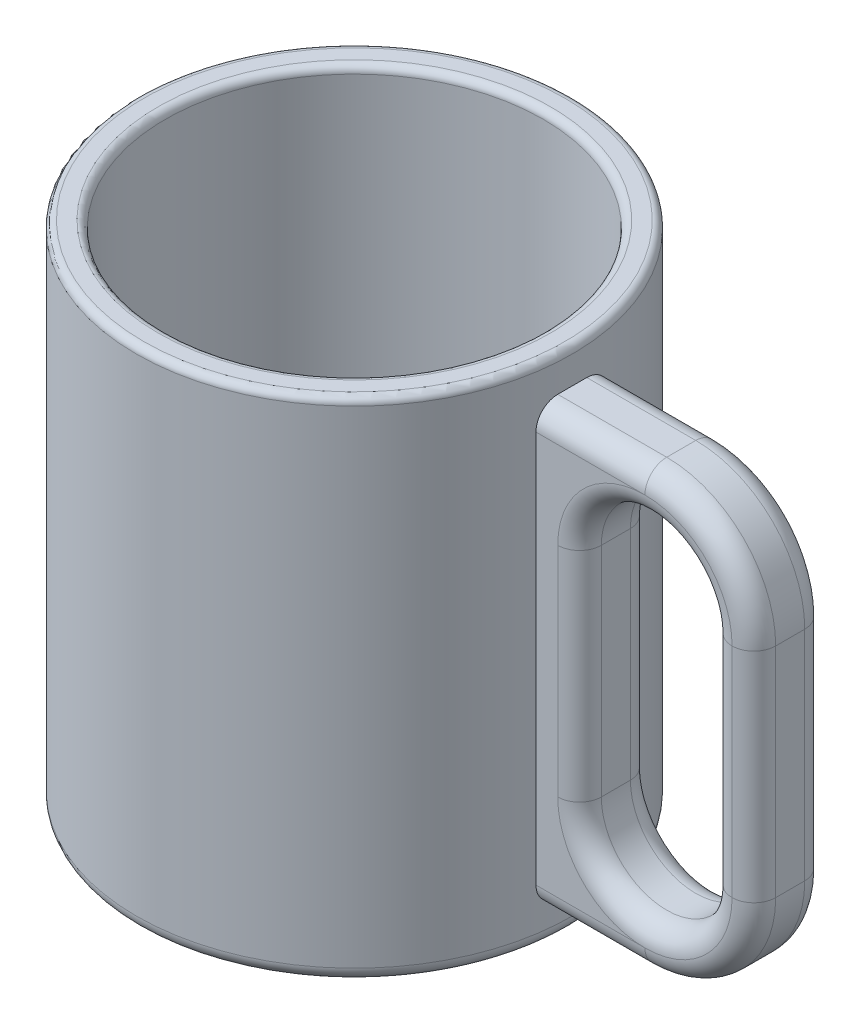
ISO-10303-21;
HEADER;
FILE_DESCRIPTION(('STEP AP214'),'2;1');
FILE_NAME('part.step','',(''),(''),'','','');
FILE_SCHEMA(('AUTOMOTIVE_DESIGN { 1 0 10303 214 1 1 1 1 }'));
ENDSEC;
DATA;
#1=APPLICATION_CONTEXT('core data for automotive mechanical design processes');
#2=APPLICATION_PROTOCOL_DEFINITION('international standard','automotive_design',2000,#1);
#3=PRODUCT_CONTEXT('',#1,'mechanical');
#4=PRODUCT('Part','Part','',(#3));
#5=PRODUCT_RELATED_PRODUCT_CATEGORY('part','',(#4));
#6=PRODUCT_DEFINITION_FORMATION('','',#4);
#7=PRODUCT_DEFINITION_CONTEXT('part definition',#1,'design');
#8=PRODUCT_DEFINITION('design','',#6,#7);
#9=PRODUCT_DEFINITION_SHAPE('','',#8);
#10=(LENGTH_UNIT() NAMED_UNIT(*) SI_UNIT(.MILLI.,.METRE.));
#11=(NAMED_UNIT(*) PLANE_ANGLE_UNIT() SI_UNIT($,.RADIAN.));
#12=(NAMED_UNIT(*) SI_UNIT($,.STERADIAN.) SOLID_ANGLE_UNIT());
#13=UNCERTAINTY_MEASURE_WITH_UNIT(LENGTH_MEASURE(1.E-05),#10,'distance_accuracy_value','');
#14=(GEOMETRIC_REPRESENTATION_CONTEXT(3) GLOBAL_UNCERTAINTY_ASSIGNED_CONTEXT((#13)) GLOBAL_UNIT_ASSIGNED_CONTEXT((#10,
#11,#12)) REPRESENTATION_CONTEXT('',''));
#15=CARTESIAN_POINT('',(0.,0.,0.));
#16=DIRECTION('',(0.,0.,1.));
#17=DIRECTION('',(1.,0.,0.));
#18=AXIS2_PLACEMENT_3D('',#15,#16,#17);
#19=CARTESIAN_POINT('',(38.4108516910939,0.,-5.));
#20=DIRECTION('',(-1.,0.,0.));
#21=DIRECTION('',(0.,0.,1.));
#22=AXIS2_PLACEMENT_3D('',#19,#20,#21);
#23=PLANE('',#22);
#24=DIRECTION('',(0.,0.,1.));
#25=VECTOR('',#24,1.);
#26=CARTESIAN_POINT('',(38.4108516910939,20.2068713764789,-5.));
#27=LINE('',#26,#25);
#28=CARTESIAN_POINT('',(38.4108516910939,20.2068713764789,-2.));
#29=VERTEX_POINT('',#28);
#30=CARTESIAN_POINT('',(38.4108516910939,20.2068713764789,2.));
#31=VERTEX_POINT('',#30);
#32=EDGE_CURVE('E209',#29,#31,#27,.T.);
#33=ORIENTED_EDGE('',*,*,#32,.F.);
#34=DIRECTION('',(0.,-1.,0.));
#35=VECTOR('',#34,1.);
#36=CARTESIAN_POINT('',(38.4108516910939,0.,-2.));
#37=LINE('',#36,#35);
#38=CARTESIAN_POINT('',(38.4108516910939,50.2068713764789,-2.));
#39=VERTEX_POINT('',#38);
#40=EDGE_CURVE('E288',#29,#39,#37,.F.);
#41=ORIENTED_EDGE('',*,*,#40,.T.);
#42=DIRECTION('',(0.,0.,1.));
#43=VECTOR('',#42,1.);
#44=CARTESIAN_POINT('',(38.4108516910939,50.2068713764789,-5.));
#45=LINE('',#44,#43);
#46=CARTESIAN_POINT('',(38.4108516910939,50.2068713764789,2.));
#47=VERTEX_POINT('',#46);
#48=EDGE_CURVE('E351',#39,#47,#45,.T.);
#49=ORIENTED_EDGE('',*,*,#48,.T.);
#50=DIRECTION('',(0.,-1.,0.));
#51=VECTOR('',#50,1.);
#52=CARTESIAN_POINT('',(38.4108516910939,20.2068713764789,2.));
#53=LINE('',#52,#51);
#54=EDGE_CURVE('E286',#47,#31,#53,.T.);
#55=ORIENTED_EDGE('',*,*,#54,.T.);
#56=EDGE_LOOP('',(#33,#41,#49,#55));
#57=FACE_BOUND('',#56,.T.);
#58=ADVANCED_FACE('F49',(#57),#23,.F.);
#59=CARTESIAN_POINT('',(23.4108516910939,20.2068713764789,-5.));
#60=DIRECTION('',(0.,0.,1.));
#61=DIRECTION('',(1.,0.,0.));
#62=AXIS2_PLACEMENT_3D('',#59,#60,#61);
#63=CYLINDRICAL_SURFACE('',#62,15.);
#64=DIRECTION('',(0.,0.,1.));
#65=VECTOR('',#64,1.);
#66=CARTESIAN_POINT('',(23.4108516910939,5.2068713764789,-5.));
#67=LINE('',#66,#65);
#68=CARTESIAN_POINT('',(23.4108516910939,5.2068713764789,-2.));
#69=VERTEX_POINT('',#68);
#70=CARTESIAN_POINT('',(23.4108516910939,5.2068713764789,2.));
#71=VERTEX_POINT('',#70);
#72=EDGE_CURVE('E215',#69,#71,#67,.T.);
#73=ORIENTED_EDGE('',*,*,#72,.F.);
#74=CARTESIAN_POINT('',(23.4108516910939,20.2068713764789,-2.));
#75=DIRECTION('',(0.,0.,1.));
#76=DIRECTION('',(1.,0.,0.));
#77=AXIS2_PLACEMENT_3D('',#74,#75,#76);
#78=CIRCLE('',#77,15.);
#79=EDGE_CURVE('E284',#69,#29,#78,.T.);
#80=ORIENTED_EDGE('',*,*,#79,.T.);
#81=ORIENTED_EDGE('',*,*,#32,.T.);
#82=CARTESIAN_POINT('',(23.4108516910939,20.2068713764789,2.));
#83=DIRECTION('',(0.,0.,1.));
#84=DIRECTION('',(1.,0.,0.));
#85=AXIS2_PLACEMENT_3D('',#82,#83,#84);
#86=CIRCLE('',#85,15.);
#87=EDGE_CURVE('E282',#31,#71,#86,.F.);
#88=ORIENTED_EDGE('',*,*,#87,.T.);
#89=EDGE_LOOP('',(#73,#80,#81,#88));
#90=FACE_BOUND('',#89,.T.);
#91=ADVANCED_FACE('F388',(#90),#63,.T.);
#92=CARTESIAN_POINT('',(0.,5.2068713764789,-5.));
#93=DIRECTION('',(0.,-1.,0.));
#94=DIRECTION('',(0.,0.,-1.));
#95=AXIS2_PLACEMENT_3D('',#92,#93,#94);
#96=PLANE('',#95);
#97=DIRECTION('',(0.,0.,1.));
#98=VECTOR('',#97,1.);
#99=CARTESIAN_POINT('',(8.41085169109387,5.2068713764789,-5.));
#100=LINE('',#99,#98);
#101=CARTESIAN_POINT('',(8.41085169109387,5.2068713764789,-2.));
#102=VERTEX_POINT('',#101);
#103=CARTESIAN_POINT('',(8.41085169109387,5.2068713764789,2.));
#104=VERTEX_POINT('',#103);
#105=EDGE_CURVE('E344',#102,#104,#100,.T.);
#106=ORIENTED_EDGE('',*,*,#105,.F.);
#107=DIRECTION('',(1.,0.,0.));
#108=VECTOR('',#107,1.);
#109=CARTESIAN_POINT('',(23.4108516910939,5.2068713764789,-2.));
#110=LINE('',#109,#108);
#111=EDGE_CURVE('E268',#102,#69,#110,.T.);
#112=ORIENTED_EDGE('',*,*,#111,.T.);
#113=ORIENTED_EDGE('',*,*,#72,.T.);
#114=DIRECTION('',(1.,0.,0.));
#115=VECTOR('',#114,1.);
#116=CARTESIAN_POINT('',(0.,5.2068713764789,2.));
#117=LINE('',#116,#115);
#118=EDGE_CURVE('E249',#71,#104,#117,.F.);
#119=ORIENTED_EDGE('',*,*,#118,.T.);
#120=EDGE_LOOP('',(#106,#112,#113,#119));
#121=FACE_BOUND('',#120,.T.);
#122=ADVANCED_FACE('F392',(#121),#96,.T.);
#123=CARTESIAN_POINT('',(8.41085169109387,0.,-5.));
#124=DIRECTION('',(-1.,0.,0.));
#125=DIRECTION('',(0.,0.,1.));
#126=AXIS2_PLACEMENT_3D('',#123,#124,#125);
#127=PLANE('',#126);
#128=DIRECTION('',(0.,-1.,0.));
#129=VECTOR('',#128,1.);
#130=CARTESIAN_POINT('',(8.41085169109387,0.,-5.));
#131=LINE('',#130,#129);
#132=CARTESIAN_POINT('',(8.41085169109387,62.2068713764789,-5.));
#133=VERTEX_POINT('',#132);
#134=CARTESIAN_POINT('',(8.41085169109387,8.2068713764789,-5.));
#135=VERTEX_POINT('',#134);
#136=EDGE_CURVE('E338',#133,#135,#131,.T.);
#137=ORIENTED_EDGE('',*,*,#136,.T.);
#138=CARTESIAN_POINT('',(8.41085169109387,8.2068713764789,-2.));
#139=DIRECTION('',(-1.,0.,0.));
#140=DIRECTION('',(0.,0.,1.));
#141=AXIS2_PLACEMENT_3D('',#138,#139,#140);
#142=CIRCLE('',#141,3.);
#143=EDGE_CURVE('E280',#135,#102,#142,.T.);
#144=ORIENTED_EDGE('',*,*,#143,.T.);
#145=ORIENTED_EDGE('',*,*,#105,.T.);
#146=CARTESIAN_POINT('',(8.41085169109387,8.2068713764789,2.));
#147=DIRECTION('',(-1.,0.,0.));
#148=DIRECTION('',(0.,0.,1.));
#149=AXIS2_PLACEMENT_3D('',#146,#147,#148);
#150=CIRCLE('',#149,3.);
#151=CARTESIAN_POINT('',(8.41085169109387,8.2068713764789,5.));
#152=VERTEX_POINT('',#151);
#153=EDGE_CURVE('E276',#104,#152,#150,.T.);
#154=ORIENTED_EDGE('',*,*,#153,.T.);
#155=DIRECTION('',(0.,-1.,0.));
#156=VECTOR('',#155,1.);
#157=CARTESIAN_POINT('',(8.41085169109387,0.,5.));
#158=LINE('',#157,#156);
#159=CARTESIAN_POINT('',(8.41085169109387,62.2068713764789,5.));
#160=VERTEX_POINT('',#159);
#161=EDGE_CURVE('E256',#160,#152,#158,.T.);
#162=ORIENTED_EDGE('',*,*,#161,.F.);
#163=CARTESIAN_POINT('',(8.41085169109387,62.2068713764789,2.));
#164=DIRECTION('',(-1.,0.,0.));
#165=DIRECTION('',(0.,0.,1.));
#166=AXIS2_PLACEMENT_3D('',#163,#164,#165);
#167=CIRCLE('',#166,3.);
#168=CARTESIAN_POINT('',(8.41085169109387,65.2068713764789,2.));
#169=VERTEX_POINT('',#168);
#170=EDGE_CURVE('E274',#160,#169,#167,.T.);
#171=ORIENTED_EDGE('',*,*,#170,.T.);
#172=DIRECTION('',(0.,0.,1.));
#173=VECTOR('',#172,1.);
#174=CARTESIAN_POINT('',(8.41085169109387,65.2068713764789,-5.));
#175=LINE('',#174,#173);
#176=CARTESIAN_POINT('',(8.41085169109387,65.2068713764789,-2.));
#177=VERTEX_POINT('',#176);
#178=EDGE_CURVE('E346',#177,#169,#175,.T.);
#179=ORIENTED_EDGE('',*,*,#178,.F.);
#180=CARTESIAN_POINT('',(8.41085169109387,62.2068713764789,-2.));
#181=DIRECTION('',(-1.,0.,0.));
#182=DIRECTION('',(0.,0.,1.));
#183=AXIS2_PLACEMENT_3D('',#180,#181,#182);
#184=CIRCLE('',#183,3.);
#185=EDGE_CURVE('E278',#177,#133,#184,.T.);
#186=ORIENTED_EDGE('',*,*,#185,.T.);
#187=EDGE_LOOP('',(#137,#144,#145,#154,#162,#171,#179,#186));
#188=FACE_BOUND('',#187,.T.);
#189=ADVANCED_FACE('F333',(#188),#127,.T.);
#190=CARTESIAN_POINT('',(0.,65.2068713764789,-5.));
#191=DIRECTION('',(0.,-1.,0.));
#192=DIRECTION('',(0.,0.,-1.));
#193=AXIS2_PLACEMENT_3D('',#190,#191,#192);
#194=PLANE('',#193);
#195=DIRECTION('',(0.,0.,1.));
#196=VECTOR('',#195,1.);
#197=CARTESIAN_POINT('',(23.4108516910939,65.2068713764789,-5.));
#198=LINE('',#197,#196);
#199=CARTESIAN_POINT('',(23.4108516910939,65.2068713764789,-2.));
#200=VERTEX_POINT('',#199);
#201=CARTESIAN_POINT('',(23.4108516910939,65.2068713764789,2.));
#202=VERTEX_POINT('',#201);
#203=EDGE_CURVE('E348',#200,#202,#198,.T.);
#204=ORIENTED_EDGE('',*,*,#203,.F.);
#205=DIRECTION('',(1.,0.,0.));
#206=VECTOR('',#205,1.);
#207=CARTESIAN_POINT('',(0.,65.2068713764789,-2.));
#208=LINE('',#207,#206);
#209=EDGE_CURVE('E292',#200,#177,#208,.F.);
#210=ORIENTED_EDGE('',*,*,#209,.T.);
#211=ORIENTED_EDGE('',*,*,#178,.T.);
#212=DIRECTION('',(1.,0.,0.));
#213=VECTOR('',#212,1.);
#214=CARTESIAN_POINT('',(23.4108516910939,65.2068713764789,2.));
#215=LINE('',#214,#213);
#216=EDGE_CURVE('E290',#169,#202,#215,.T.);
#217=ORIENTED_EDGE('',*,*,#216,.T.);
#218=EDGE_LOOP('',(#204,#210,#211,#217));
#219=FACE_BOUND('',#218,.T.);
#220=ADVANCED_FACE('F433',(#219),#194,.F.);
#221=CARTESIAN_POINT('',(23.4108516910939,50.2068713764789,-5.));
#222=DIRECTION('',(0.,0.,1.));
#223=DIRECTION('',(1.,0.,0.));
#224=AXIS2_PLACEMENT_3D('',#221,#222,#223);
#225=CYLINDRICAL_SURFACE('',#224,9.00000000000001);
#226=DIRECTION('',(0.,0.,1.));
#227=VECTOR('',#226,1.);
#228=CARTESIAN_POINT('',(14.4108516910939,50.2068713764789,-5.));
#229=LINE('',#228,#227);
#230=CARTESIAN_POINT('',(14.4108516910939,50.2068713764789,-2.));
#231=VERTEX_POINT('',#230);
#232=CARTESIAN_POINT('',(14.4108516910939,50.2068713764789,2.));
#233=VERTEX_POINT('',#232);
#234=EDGE_CURVE('E354',#231,#233,#229,.T.);
#235=ORIENTED_EDGE('',*,*,#234,.F.);
#236=CARTESIAN_POINT('',(23.4108516910939,50.2068713764789,-2.));
#237=DIRECTION('',(0.,0.,1.));
#238=DIRECTION('',(1.,0.,0.));
#239=AXIS2_PLACEMENT_3D('',#236,#237,#238);
#240=CIRCLE('',#239,9.00000000000001);
#241=CARTESIAN_POINT('',(32.4108516910939,50.2068713764789,-2.));
#242=VERTEX_POINT('',#241);
#243=EDGE_CURVE('E198',#231,#242,#240,.F.);
#244=ORIENTED_EDGE('',*,*,#243,.T.);
#245=DIRECTION('',(0.,0.,1.));
#246=VECTOR('',#245,1.);
#247=CARTESIAN_POINT('',(32.4108516910939,50.2068713764789,-5.));
#248=LINE('',#247,#246);
#249=CARTESIAN_POINT('',(32.4108516910939,50.2068713764789,2.));
#250=VERTEX_POINT('',#249);
#251=EDGE_CURVE('E218',#242,#250,#248,.T.);
#252=ORIENTED_EDGE('',*,*,#251,.T.);
#253=CARTESIAN_POINT('',(23.4108516910939,50.2068713764789,2.));
#254=DIRECTION('',(0.,0.,1.));
#255=DIRECTION('',(1.,0.,0.));
#256=AXIS2_PLACEMENT_3D('',#253,#254,#255);
#257=CIRCLE('',#256,9.00000000000001);
#258=EDGE_CURVE('E224',#250,#233,#257,.T.);
#259=ORIENTED_EDGE('',*,*,#258,.T.);
#260=EDGE_LOOP('',(#235,#244,#252,#259));
#261=FACE_BOUND('',#260,.T.);
#262=ADVANCED_FACE('F368',(#261),#225,.F.);
#263=CARTESIAN_POINT('',(14.4108516910939,0.,-5.));
#264=DIRECTION('',(-1.,0.,0.));
#265=DIRECTION('',(0.,0.,1.));
#266=AXIS2_PLACEMENT_3D('',#263,#264,#265);
#267=PLANE('',#266);
#268=DIRECTION('',(0.,0.,1.));
#269=VECTOR('',#268,1.);
#270=CARTESIAN_POINT('',(14.4108516910939,20.2068713764789,-5.));
#271=LINE('',#270,#269);
#272=CARTESIAN_POINT('',(14.4108516910939,20.2068713764789,-2.));
#273=VERTEX_POINT('',#272);
#274=CARTESIAN_POINT('',(14.4108516910939,20.2068713764789,2.));
#275=VERTEX_POINT('',#274);
#276=EDGE_CURVE('E357',#273,#275,#271,.T.);
#277=ORIENTED_EDGE('',*,*,#276,.F.);
#278=DIRECTION('',(0.,-1.,0.));
#279=VECTOR('',#278,1.);
#280=CARTESIAN_POINT('',(14.4108516910939,0.,-2.));
#281=LINE('',#280,#279);
#282=EDGE_CURVE('E248',#273,#231,#281,.F.);
#283=ORIENTED_EDGE('',*,*,#282,.T.);
#284=ORIENTED_EDGE('',*,*,#234,.T.);
#285=DIRECTION('',(0.,-1.,0.));
#286=VECTOR('',#285,1.);
#287=CARTESIAN_POINT('',(14.4108516910939,20.2068713764789,2.));
#288=LINE('',#287,#286);
#289=EDGE_CURVE('E246',#233,#275,#288,.T.);
#290=ORIENTED_EDGE('',*,*,#289,.T.);
#291=EDGE_LOOP('',(#277,#283,#284,#290));
#292=FACE_BOUND('',#291,.T.);
#293=ADVANCED_FACE('F421',(#292),#267,.F.);
#294=CARTESIAN_POINT('',(23.4108516910939,20.2068713764789,-5.));
#295=DIRECTION('',(0.,0.,1.));
#296=DIRECTION('',(1.,0.,0.));
#297=AXIS2_PLACEMENT_3D('',#294,#295,#296);
#298=CYLINDRICAL_SURFACE('',#297,9.);
#299=DIRECTION('',(0.,0.,1.));
#300=VECTOR('',#299,1.);
#301=CARTESIAN_POINT('',(32.4108516910939,20.2068713764789,-5.));
#302=LINE('',#301,#300);
#303=CARTESIAN_POINT('',(32.4108516910939,20.2068713764789,-2.));
#304=VERTEX_POINT('',#303);
#305=CARTESIAN_POINT('',(32.4108516910939,20.2068713764789,2.));
#306=VERTEX_POINT('',#305);
#307=EDGE_CURVE('E359',#304,#306,#302,.T.);
#308=ORIENTED_EDGE('',*,*,#307,.F.);
#309=CARTESIAN_POINT('',(23.4108516910939,20.2068713764789,-2.));
#310=DIRECTION('',(0.,0.,1.));
#311=DIRECTION('',(1.,0.,0.));
#312=AXIS2_PLACEMENT_3D('',#309,#310,#311);
#313=CIRCLE('',#312,9.);
#314=EDGE_CURVE('E234',#304,#273,#313,.F.);
#315=ORIENTED_EDGE('',*,*,#314,.T.);
#316=ORIENTED_EDGE('',*,*,#276,.T.);
#317=CARTESIAN_POINT('',(23.4108516910939,20.2068713764789,2.));
#318=DIRECTION('',(0.,0.,1.));
#319=DIRECTION('',(1.,0.,0.));
#320=AXIS2_PLACEMENT_3D('',#317,#318,#319);
#321=CIRCLE('',#320,9.);
#322=EDGE_CURVE('E232',#275,#306,#321,.T.);
#323=ORIENTED_EDGE('',*,*,#322,.T.);
#324=EDGE_LOOP('',(#308,#315,#316,#323));
#325=FACE_BOUND('',#324,.T.);
#326=ADVANCED_FACE('F424',(#325),#298,.F.);
#327=CARTESIAN_POINT('',(32.4108516910939,0.,-5.));
#328=DIRECTION('',(-1.,0.,0.));
#329=DIRECTION('',(0.,0.,1.));
#330=AXIS2_PLACEMENT_3D('',#327,#328,#329);
#331=PLANE('',#330);
#332=ORIENTED_EDGE('',*,*,#251,.F.);
#333=DIRECTION('',(0.,-1.,0.));
#334=VECTOR('',#333,1.);
#335=CARTESIAN_POINT('',(32.4108516910939,20.2068713764789,-2.));
#336=LINE('',#335,#334);
#337=EDGE_CURVE('E230',#242,#304,#336,.T.);
#338=ORIENTED_EDGE('',*,*,#337,.T.);
#339=ORIENTED_EDGE('',*,*,#307,.T.);
#340=DIRECTION('',(0.,-1.,0.));
#341=VECTOR('',#340,1.);
#342=CARTESIAN_POINT('',(32.4108516910939,0.,2.));
#343=LINE('',#342,#341);
#344=EDGE_CURVE('E227',#306,#250,#343,.F.);
#345=ORIENTED_EDGE('',*,*,#344,.T.);
#346=EDGE_LOOP('',(#332,#338,#339,#345));
#347=FACE_BOUND('',#346,.T.);
#348=ADVANCED_FACE('F370',(#347),#331,.T.);
#349=CARTESIAN_POINT('',(23.4108516910939,50.2068713764789,-5.));
#350=DIRECTION('',(0.,0.,1.));
#351=DIRECTION('',(1.,0.,0.));
#352=AXIS2_PLACEMENT_3D('',#349,#350,#351);
#353=CYLINDRICAL_SURFACE('',#352,15.);
#354=ORIENTED_EDGE('',*,*,#48,.F.);
#355=CARTESIAN_POINT('',(23.4108516910939,50.2068713764789,-2.));
#356=DIRECTION('',(0.,0.,1.));
#357=DIRECTION('',(1.,0.,0.));
#358=AXIS2_PLACEMENT_3D('',#355,#356,#357);
#359=CIRCLE('',#358,15.);
#360=EDGE_CURVE('E12',#39,#200,#359,.T.);
#361=ORIENTED_EDGE('',*,*,#360,.T.);
#362=ORIENTED_EDGE('',*,*,#203,.T.);
#363=CARTESIAN_POINT('',(23.4108516910939,50.2068713764789,2.));
#364=DIRECTION('',(0.,0.,1.));
#365=DIRECTION('',(1.,0.,0.));
#366=AXIS2_PLACEMENT_3D('',#363,#364,#365);
#367=CIRCLE('',#366,15.);
#368=EDGE_CURVE('E58',#202,#47,#367,.F.);
#369=ORIENTED_EDGE('',*,*,#368,.T.);
#370=EDGE_LOOP('',(#354,#361,#362,#369));
#371=FACE_BOUND('',#370,.T.);
#372=ADVANCED_FACE('F419',(#371),#353,.T.);
#373=CARTESIAN_POINT('',(0.,0.,-5.));
#374=DIRECTION('',(0.,0.,1.));
#375=DIRECTION('',(1.,0.,0.));
#376=AXIS2_PLACEMENT_3D('',#373,#374,#375);
#377=PLANE('',#376);
#378=CARTESIAN_POINT('',(23.4108516910939,20.2068713764789,-5.));
#379=DIRECTION('',(0.,0.,1.));
#380=DIRECTION('',(1.,0.,0.));
#381=AXIS2_PLACEMENT_3D('',#378,#379,#380);
#382=CIRCLE('',#381,12.);
#383=CARTESIAN_POINT('',(11.4108516910939,20.2068713764789,-5.));
#384=VERTEX_POINT('',#383);
#385=CARTESIAN_POINT('',(23.4108516910939,8.2068713764789,-5.));
#386=VERTEX_POINT('',#385);
#387=EDGE_CURVE('E212',#384,#386,#382,.T.);
#388=ORIENTED_EDGE('',*,*,#387,.T.);
#389=DIRECTION('',(1.,0.,0.));
#390=VECTOR('',#389,1.);
#391=CARTESIAN_POINT('',(8.41085169109387,8.2068713764789,-5.));
#392=LINE('',#391,#390);
#393=EDGE_CURVE('E272',#386,#135,#392,.F.);
#394=ORIENTED_EDGE('',*,*,#393,.T.);
#395=ORIENTED_EDGE('',*,*,#136,.F.);
#396=DIRECTION('',(1.,0.,0.));
#397=VECTOR('',#396,1.);
#398=CARTESIAN_POINT('',(0.,62.2068713764789,-5.));
#399=LINE('',#398,#397);
#400=CARTESIAN_POINT('',(23.4108516910939,62.2068713764789,-5.));
#401=VERTEX_POINT('',#400);
#402=EDGE_CURVE('E186',#133,#401,#399,.T.);
#403=ORIENTED_EDGE('',*,*,#402,.T.);
#404=CARTESIAN_POINT('',(23.4108516910939,50.2068713764789,-5.));
#405=DIRECTION('',(0.,0.,1.));
#406=DIRECTION('',(1.,0.,0.));
#407=AXIS2_PLACEMENT_3D('',#404,#405,#406);
#408=CIRCLE('',#407,12.);
#409=CARTESIAN_POINT('',(11.4108516910939,50.2068713764789,-5.));
#410=VERTEX_POINT('',#409);
#411=EDGE_CURVE('E177',#401,#410,#408,.T.);
#412=ORIENTED_EDGE('',*,*,#411,.T.);
#413=DIRECTION('',(0.,-1.,0.));
#414=VECTOR('',#413,1.);
#415=CARTESIAN_POINT('',(11.4108516910939,0.,-5.));
#416=LINE('',#415,#414);
#417=EDGE_CURVE('E182',#410,#384,#416,.T.);
#418=ORIENTED_EDGE('',*,*,#417,.T.);
#419=EDGE_LOOP('',(#388,#394,#395,#403,#412,#418));
#420=FACE_BOUND('',#419,.T.);
#421=ADVANCED_FACE('F180',(#420),#377,.F.);
#422=CARTESIAN_POINT('',(0.,0.,5.));
#423=DIRECTION('',(0.,0.,1.));
#424=DIRECTION('',(1.,0.,0.));
#425=AXIS2_PLACEMENT_3D('',#422,#423,#424);
#426=PLANE('',#425);
#427=ORIENTED_EDGE('',*,*,#161,.T.);
#428=DIRECTION('',(1.,0.,0.));
#429=VECTOR('',#428,1.);
#430=CARTESIAN_POINT('',(0.,8.2068713764789,5.));
#431=LINE('',#430,#429);
#432=CARTESIAN_POINT('',(23.4108516910939,8.2068713764789,5.));
#433=VERTEX_POINT('',#432);
#434=EDGE_CURVE('E296',#152,#433,#431,.T.);
#435=ORIENTED_EDGE('',*,*,#434,.T.);
#436=CARTESIAN_POINT('',(23.4108516910939,20.2068713764789,5.));
#437=DIRECTION('',(0.,0.,1.));
#438=DIRECTION('',(1.,0.,0.));
#439=AXIS2_PLACEMENT_3D('',#436,#437,#438);
#440=CIRCLE('',#439,12.);
#441=CARTESIAN_POINT('',(11.4108516910939,20.2068713764789,5.));
#442=VERTEX_POINT('',#441);
#443=EDGE_CURVE('E240',#433,#442,#440,.F.);
#444=ORIENTED_EDGE('',*,*,#443,.T.);
#445=DIRECTION('',(0.,-1.,0.));
#446=VECTOR('',#445,1.);
#447=CARTESIAN_POINT('',(11.4108516910939,50.2068713764789,5.));
#448=LINE('',#447,#446);
#449=CARTESIAN_POINT('',(11.4108516910939,50.2068713764789,5.));
#450=VERTEX_POINT('',#449);
#451=EDGE_CURVE('E238',#442,#450,#448,.F.);
#452=ORIENTED_EDGE('',*,*,#451,.T.);
#453=CARTESIAN_POINT('',(23.4108516910939,50.2068713764789,5.));
#454=DIRECTION('',(0.,0.,1.));
#455=DIRECTION('',(1.,0.,0.));
#456=AXIS2_PLACEMENT_3D('',#453,#454,#455);
#457=CIRCLE('',#456,12.);
#458=CARTESIAN_POINT('',(23.4108516910939,62.2068713764789,5.));
#459=VERTEX_POINT('',#458);
#460=EDGE_CURVE('E236',#450,#459,#457,.F.);
#461=ORIENTED_EDGE('',*,*,#460,.T.);
#462=DIRECTION('',(1.,0.,0.));
#463=VECTOR('',#462,1.);
#464=CARTESIAN_POINT('',(8.41085169109387,62.2068713764789,5.));
#465=LINE('',#464,#463);
#466=EDGE_CURVE('E294',#459,#160,#465,.F.);
#467=ORIENTED_EDGE('',*,*,#466,.T.);
#468=EDGE_LOOP('',(#427,#435,#444,#452,#461,#467));
#469=FACE_BOUND('',#468,.T.);
#470=ADVANCED_FACE('F330',(#469),#426,.T.);
#471=CARTESIAN_POINT('',(23.4108516910939,20.2068713764789,-2.));
#472=DIRECTION('',(0.,0.,1.));
#473=DIRECTION('',(1.,0.,0.));
#474=AXIS2_PLACEMENT_3D('',#471,#472,#473);
#475=TOROIDAL_SURFACE('',#474,12.,3.);
#476=CARTESIAN_POINT('',(11.4108516910939,20.2068713764789,-2.));
#477=DIRECTION('',(0.,1.,0.));
#478=DIRECTION('',(0.,0.,1.));
#479=AXIS2_PLACEMENT_3D('',#476,#477,#478);
#480=CIRCLE('',#479,3.);
#481=EDGE_CURVE('E207',#273,#384,#480,.T.);
#482=ORIENTED_EDGE('',*,*,#481,.F.);
#483=ORIENTED_EDGE('',*,*,#314,.F.);
#484=CARTESIAN_POINT('',(35.4108516910939,20.2068713764789,-2.));
#485=DIRECTION('',(0.,1.,0.));
#486=DIRECTION('',(0.,0.,1.));
#487=AXIS2_PLACEMENT_3D('',#484,#485,#486);
#488=CIRCLE('',#487,3.);
#489=CARTESIAN_POINT('',(35.4108516910939,20.2068713764789,-5.));
#490=VERTEX_POINT('',#489);
#491=EDGE_CURVE('E253',#490,#304,#488,.T.);
#492=ORIENTED_EDGE('',*,*,#491,.F.);
#493=EDGE_CURVE('E208',#386,#490,#382,.T.);
#494=ORIENTED_EDGE('',*,*,#493,.F.);
#495=ORIENTED_EDGE('',*,*,#387,.F.);
#496=EDGE_LOOP('',(#482,#483,#492,#494,#495));
#497=FACE_BOUND('',#496,.T.);
#498=ADVANCED_FACE('F441',(#497),#475,.T.);
#499=CARTESIAN_POINT('',(35.4108516910939,0.,-2.));
#500=DIRECTION('',(0.,1.,0.));
#501=DIRECTION('',(0.,0.,1.));
#502=AXIS2_PLACEMENT_3D('',#499,#500,#501);
#503=CYLINDRICAL_SURFACE('',#502,3.);
#504=ORIENTED_EDGE('',*,*,#491,.T.);
#505=ORIENTED_EDGE('',*,*,#337,.F.);
#506=CARTESIAN_POINT('',(35.4108516910939,50.2068713764789,-2.));
#507=DIRECTION('',(0.,1.,0.));
#508=DIRECTION('',(0.,0.,1.));
#509=AXIS2_PLACEMENT_3D('',#506,#507,#508);
#510=CIRCLE('',#509,3.);
#511=CARTESIAN_POINT('',(35.4108516910939,50.2068713764789,-5.));
#512=VERTEX_POINT('',#511);
#513=EDGE_CURVE('E201',#512,#242,#510,.T.);
#514=ORIENTED_EDGE('',*,*,#513,.F.);
#515=DIRECTION('',(0.,-1.,0.));
#516=VECTOR('',#515,1.);
#517=CARTESIAN_POINT('',(35.4108516910939,50.2068713764789,-5.));
#518=LINE('',#517,#516);
#519=EDGE_CURVE('E191',#490,#512,#518,.F.);
#520=ORIENTED_EDGE('',*,*,#519,.F.);
#521=EDGE_LOOP('',(#504,#505,#514,#520));
#522=FACE_BOUND('',#521,.T.);
#523=ADVANCED_FACE('F438',(#522),#503,.T.);
#524=CARTESIAN_POINT('',(11.4108516910939,0.,-2.));
#525=DIRECTION('',(0.,-1.,0.));
#526=DIRECTION('',(0.,0.,-1.));
#527=AXIS2_PLACEMENT_3D('',#524,#525,#526);
#528=CYLINDRICAL_SURFACE('',#527,3.);
#529=ORIENTED_EDGE('',*,*,#481,.T.);
#530=ORIENTED_EDGE('',*,*,#417,.F.);
#531=CARTESIAN_POINT('',(11.4108516910939,50.2068713764789,-2.));
#532=DIRECTION('',(0.,1.,0.));
#533=DIRECTION('',(0.,0.,1.));
#534=AXIS2_PLACEMENT_3D('',#531,#532,#533);
#535=CIRCLE('',#534,3.);
#536=EDGE_CURVE('E195',#231,#410,#535,.T.);
#537=ORIENTED_EDGE('',*,*,#536,.F.);
#538=ORIENTED_EDGE('',*,*,#282,.F.);
#539=EDGE_LOOP('',(#529,#530,#537,#538));
#540=FACE_BOUND('',#539,.T.);
#541=ADVANCED_FACE('F205',(#540),#528,.T.);
#542=CARTESIAN_POINT('',(23.4108516910939,50.2068713764789,-2.));
#543=DIRECTION('',(0.,0.,1.));
#544=DIRECTION('',(1.,0.,0.));
#545=AXIS2_PLACEMENT_3D('',#542,#543,#544);
#546=TOROIDAL_SURFACE('',#545,12.,3.);
#547=ORIENTED_EDGE('',*,*,#513,.T.);
#548=ORIENTED_EDGE('',*,*,#243,.F.);
#549=ORIENTED_EDGE('',*,*,#536,.T.);
#550=ORIENTED_EDGE('',*,*,#411,.F.);
#551=EDGE_CURVE('E190',#512,#401,#408,.T.);
#552=ORIENTED_EDGE('',*,*,#551,.F.);
#553=EDGE_LOOP('',(#547,#548,#549,#550,#552));
#554=FACE_BOUND('',#553,.T.);
#555=ADVANCED_FACE('F196',(#554),#546,.T.);
#556=CARTESIAN_POINT('',(11.4108516910939,0.,2.));
#557=DIRECTION('',(0.,1.,0.));
#558=DIRECTION('',(0.,0.,1.));
#559=AXIS2_PLACEMENT_3D('',#556,#557,#558);
#560=CYLINDRICAL_SURFACE('',#559,3.);
#561=CARTESIAN_POINT('',(11.4108516910939,20.2068713764789,2.));
#562=DIRECTION('',(0.,-1.,0.));
#563=DIRECTION('',(0.,0.,-1.));
#564=AXIS2_PLACEMENT_3D('',#561,#562,#563);
#565=CIRCLE('',#564,3.);
#566=EDGE_CURVE('E262',#275,#442,#565,.T.);
#567=ORIENTED_EDGE('',*,*,#566,.F.);
#568=ORIENTED_EDGE('',*,*,#289,.F.);
#569=CARTESIAN_POINT('',(11.4108516910939,50.2068713764789,2.));
#570=DIRECTION('',(0.,1.,0.));
#571=DIRECTION('',(0.,0.,1.));
#572=AXIS2_PLACEMENT_3D('',#569,#570,#571);
#573=CIRCLE('',#572,3.);
#574=EDGE_CURVE('E202',#450,#233,#573,.T.);
#575=ORIENTED_EDGE('',*,*,#574,.F.);
#576=ORIENTED_EDGE('',*,*,#451,.F.);
#577=EDGE_LOOP('',(#567,#568,#575,#576));
#578=FACE_BOUND('',#577,.T.);
#579=ADVANCED_FACE('F399',(#578),#560,.T.);
#580=CARTESIAN_POINT('',(23.4108516910939,50.2068713764789,2.));
#581=DIRECTION('',(0.,0.,1.));
#582=DIRECTION('',(1.,0.,0.));
#583=AXIS2_PLACEMENT_3D('',#580,#581,#582);
#584=TOROIDAL_SURFACE('',#583,12.,3.);
#585=ORIENTED_EDGE('',*,*,#574,.T.);
#586=ORIENTED_EDGE('',*,*,#258,.F.);
#587=CARTESIAN_POINT('',(35.4108516910939,50.2068713764789,2.));
#588=DIRECTION('',(0.,-1.,0.));
#589=DIRECTION('',(0.,0.,-1.));
#590=AXIS2_PLACEMENT_3D('',#587,#588,#589);
#591=CIRCLE('',#590,3.);
#592=CARTESIAN_POINT('',(35.4108516910939,50.2068713764789,5.));
#593=VERTEX_POINT('',#592);
#594=EDGE_CURVE('E259',#593,#250,#591,.T.);
#595=ORIENTED_EDGE('',*,*,#594,.F.);
#596=EDGE_CURVE('E74',#459,#593,#457,.F.);
#597=ORIENTED_EDGE('',*,*,#596,.F.);
#598=ORIENTED_EDGE('',*,*,#460,.F.);
#599=EDGE_LOOP('',(#585,#586,#595,#597,#598));
#600=FACE_BOUND('',#599,.T.);
#601=ADVANCED_FACE('F401',(#600),#584,.T.);
#602=CARTESIAN_POINT('',(23.4108516910939,20.2068713764789,2.));
#603=DIRECTION('',(0.,0.,1.));
#604=DIRECTION('',(1.,0.,0.));
#605=AXIS2_PLACEMENT_3D('',#602,#603,#604);
#606=TOROIDAL_SURFACE('',#605,12.,3.);
#607=ORIENTED_EDGE('',*,*,#566,.T.);
#608=ORIENTED_EDGE('',*,*,#443,.F.);
#609=CARTESIAN_POINT('',(35.4108516910939,20.2068713764789,5.));
#610=VERTEX_POINT('',#609);
#611=EDGE_CURVE('E241',#610,#433,#440,.F.);
#612=ORIENTED_EDGE('',*,*,#611,.F.);
#613=CARTESIAN_POINT('',(35.4108516910939,20.2068713764789,2.));
#614=DIRECTION('',(0.,1.,0.));
#615=DIRECTION('',(0.,0.,1.));
#616=AXIS2_PLACEMENT_3D('',#613,#614,#615);
#617=CIRCLE('',#616,3.);
#618=EDGE_CURVE('E257',#306,#610,#617,.T.);
#619=ORIENTED_EDGE('',*,*,#618,.F.);
#620=ORIENTED_EDGE('',*,*,#322,.F.);
#621=EDGE_LOOP('',(#607,#608,#612,#619,#620));
#622=FACE_BOUND('',#621,.T.);
#623=ADVANCED_FACE('F379',(#622),#606,.T.);
#624=CARTESIAN_POINT('',(35.4108516910939,0.,2.));
#625=DIRECTION('',(0.,-1.,0.));
#626=DIRECTION('',(0.,0.,-1.));
#627=AXIS2_PLACEMENT_3D('',#624,#625,#626);
#628=CYLINDRICAL_SURFACE('',#627,3.);
#629=ORIENTED_EDGE('',*,*,#594,.T.);
#630=ORIENTED_EDGE('',*,*,#344,.F.);
#631=ORIENTED_EDGE('',*,*,#618,.T.);
#632=DIRECTION('',(0.,-1.,0.));
#633=VECTOR('',#632,1.);
#634=CARTESIAN_POINT('',(35.4108516910939,0.,5.));
#635=LINE('',#634,#633);
#636=EDGE_CURVE('E243',#593,#610,#635,.T.);
#637=ORIENTED_EDGE('',*,*,#636,.F.);
#638=EDGE_LOOP('',(#629,#630,#631,#637));
#639=FACE_BOUND('',#638,.T.);
#640=ADVANCED_FACE('F374',(#639),#628,.T.);
#641=CARTESIAN_POINT('',(0.,62.2068713764789,-2.));
#642=DIRECTION('',(1.,0.,0.));
#643=DIRECTION('',(0.,0.,-1.));
#644=AXIS2_PLACEMENT_3D('',#641,#642,#643);
#645=CYLINDRICAL_SURFACE('',#644,3.);
#646=ORIENTED_EDGE('',*,*,#185,.F.);
#647=ORIENTED_EDGE('',*,*,#209,.F.);
#648=CARTESIAN_POINT('',(23.4108516910939,62.2068713764789,-2.));
#649=DIRECTION('',(1.,0.,0.));
#650=DIRECTION('',(0.,0.,-1.));
#651=AXIS2_PLACEMENT_3D('',#648,#649,#650);
#652=CIRCLE('',#651,3.);
#653=EDGE_CURVE('E260',#401,#200,#652,.T.);
#654=ORIENTED_EDGE('',*,*,#653,.F.);
#655=ORIENTED_EDGE('',*,*,#402,.F.);
#656=EDGE_LOOP('',(#646,#647,#654,#655));
#657=FACE_BOUND('',#656,.T.);
#658=ADVANCED_FACE('F447',(#657),#645,.T.);
#659=CARTESIAN_POINT('',(23.4108516910939,50.2068713764789,-2.));
#660=DIRECTION('',(0.,0.,1.));
#661=DIRECTION('',(1.,0.,0.));
#662=AXIS2_PLACEMENT_3D('',#659,#660,#661);
#663=TOROIDAL_SURFACE('',#662,12.,3.);
#664=ORIENTED_EDGE('',*,*,#653,.T.);
#665=ORIENTED_EDGE('',*,*,#360,.F.);
#666=CARTESIAN_POINT('',(35.4108516910939,50.2068713764789,-2.));
#667=DIRECTION('',(0.,-1.,0.));
#668=DIRECTION('',(0.,0.,-1.));
#669=AXIS2_PLACEMENT_3D('',#666,#667,#668);
#670=CIRCLE('',#669,3.);
#671=EDGE_CURVE('E305',#512,#39,#670,.T.);
#672=ORIENTED_EDGE('',*,*,#671,.F.);
#673=ORIENTED_EDGE('',*,*,#551,.T.);
#674=EDGE_LOOP('',(#664,#665,#672,#673));
#675=FACE_BOUND('',#674,.T.);
#676=ADVANCED_FACE('F451',(#675),#663,.T.);
#677=CARTESIAN_POINT('',(35.4108516910939,0.,-2.));
#678=DIRECTION('',(0.,-1.,0.));
#679=DIRECTION('',(0.,0.,-1.));
#680=AXIS2_PLACEMENT_3D('',#677,#678,#679);
#681=CYLINDRICAL_SURFACE('',#680,3.);
#682=ORIENTED_EDGE('',*,*,#671,.T.);
#683=ORIENTED_EDGE('',*,*,#40,.F.);
#684=CARTESIAN_POINT('',(35.4108516910939,20.2068713764789,-2.));
#685=DIRECTION('',(0.,-1.,0.));
#686=DIRECTION('',(0.,0.,-1.));
#687=AXIS2_PLACEMENT_3D('',#684,#685,#686);
#688=CIRCLE('',#687,3.);
#689=EDGE_CURVE('E302',#490,#29,#688,.T.);
#690=ORIENTED_EDGE('',*,*,#689,.F.);
#691=ORIENTED_EDGE('',*,*,#519,.T.);
#692=EDGE_LOOP('',(#682,#683,#690,#691));
#693=FACE_BOUND('',#692,.T.);
#694=ADVANCED_FACE('F457',(#693),#681,.T.);
#695=CARTESIAN_POINT('',(23.4108516910939,20.2068713764789,-2.));
#696=DIRECTION('',(0.,0.,1.));
#697=DIRECTION('',(1.,0.,0.));
#698=AXIS2_PLACEMENT_3D('',#695,#696,#697);
#699=TOROIDAL_SURFACE('',#698,12.,3.);
#700=ORIENTED_EDGE('',*,*,#689,.T.);
#701=ORIENTED_EDGE('',*,*,#79,.F.);
#702=CARTESIAN_POINT('',(23.4108516910939,8.2068713764789,-2.));
#703=DIRECTION('',(-1.,0.,0.));
#704=DIRECTION('',(0.,0.,1.));
#705=AXIS2_PLACEMENT_3D('',#702,#703,#704);
#706=CIRCLE('',#705,3.);
#707=EDGE_CURVE('E300',#386,#69,#706,.T.);
#708=ORIENTED_EDGE('',*,*,#707,.F.);
#709=ORIENTED_EDGE('',*,*,#493,.T.);
#710=EDGE_LOOP('',(#700,#701,#708,#709));
#711=FACE_BOUND('',#710,.T.);
#712=ADVANCED_FACE('F476',(#711),#699,.T.);
#713=CARTESIAN_POINT('',(0.,8.2068713764789,-2.));
#714=DIRECTION('',(-1.,0.,0.));
#715=DIRECTION('',(0.,0.,1.));
#716=AXIS2_PLACEMENT_3D('',#713,#714,#715);
#717=CYLINDRICAL_SURFACE('',#716,3.);
#718=ORIENTED_EDGE('',*,*,#143,.F.);
#719=ORIENTED_EDGE('',*,*,#393,.F.);
#720=ORIENTED_EDGE('',*,*,#707,.T.);
#721=ORIENTED_EDGE('',*,*,#111,.F.);
#722=EDGE_LOOP('',(#718,#719,#720,#721));
#723=FACE_BOUND('',#722,.T.);
#724=ADVANCED_FACE('F472',(#723),#717,.T.);
#725=CARTESIAN_POINT('',(0.,62.2068713764789,2.));
#726=DIRECTION('',(-1.,0.,0.));
#727=DIRECTION('',(0.,0.,1.));
#728=AXIS2_PLACEMENT_3D('',#725,#726,#727);
#729=CYLINDRICAL_SURFACE('',#728,3.);
#730=ORIENTED_EDGE('',*,*,#170,.F.);
#731=ORIENTED_EDGE('',*,*,#466,.F.);
#732=CARTESIAN_POINT('',(23.4108516910939,62.2068713764789,2.));
#733=DIRECTION('',(1.,0.,0.));
#734=DIRECTION('',(0.,0.,-1.));
#735=AXIS2_PLACEMENT_3D('',#732,#733,#734);
#736=CIRCLE('',#735,3.);
#737=EDGE_CURVE('E53',#202,#459,#736,.T.);
#738=ORIENTED_EDGE('',*,*,#737,.F.);
#739=ORIENTED_EDGE('',*,*,#216,.F.);
#740=EDGE_LOOP('',(#730,#731,#738,#739));
#741=FACE_BOUND('',#740,.T.);
#742=ADVANCED_FACE('F51',(#741),#729,.T.);
#743=CARTESIAN_POINT('',(23.4108516910939,50.2068713764789,2.));
#744=DIRECTION('',(0.,0.,1.));
#745=DIRECTION('',(1.,0.,0.));
#746=AXIS2_PLACEMENT_3D('',#743,#744,#745);
#747=TOROIDAL_SURFACE('',#746,12.,3.);
#748=ORIENTED_EDGE('',*,*,#737,.T.);
#749=ORIENTED_EDGE('',*,*,#596,.T.);
#750=CARTESIAN_POINT('',(35.4108516910939,50.2068713764789,2.));
#751=DIRECTION('',(0.,-1.,0.));
#752=DIRECTION('',(0.,0.,-1.));
#753=AXIS2_PLACEMENT_3D('',#750,#751,#752);
#754=CIRCLE('',#753,3.);
#755=EDGE_CURVE('E313',#47,#593,#754,.T.);
#756=ORIENTED_EDGE('',*,*,#755,.F.);
#757=ORIENTED_EDGE('',*,*,#368,.F.);
#758=EDGE_LOOP('',(#748,#749,#756,#757));
#759=FACE_BOUND('',#758,.T.);
#760=ADVANCED_FACE('F322',(#759),#747,.T.);
#761=CARTESIAN_POINT('',(35.4108516910939,0.,2.));
#762=DIRECTION('',(0.,1.,0.));
#763=DIRECTION('',(0.,0.,1.));
#764=AXIS2_PLACEMENT_3D('',#761,#762,#763);
#765=CYLINDRICAL_SURFACE('',#764,3.);
#766=ORIENTED_EDGE('',*,*,#755,.T.);
#767=ORIENTED_EDGE('',*,*,#636,.T.);
#768=CARTESIAN_POINT('',(35.4108516910939,20.2068713764789,2.));
#769=DIRECTION('',(0.,-1.,0.));
#770=DIRECTION('',(0.,0.,-1.));
#771=AXIS2_PLACEMENT_3D('',#768,#769,#770);
#772=CIRCLE('',#771,3.);
#773=EDGE_CURVE('E311',#31,#610,#772,.T.);
#774=ORIENTED_EDGE('',*,*,#773,.F.);
#775=ORIENTED_EDGE('',*,*,#54,.F.);
#776=EDGE_LOOP('',(#766,#767,#774,#775));
#777=FACE_BOUND('',#776,.T.);
#778=ADVANCED_FACE('F383',(#777),#765,.T.);
#779=CARTESIAN_POINT('',(23.4108516910939,20.2068713764789,2.));
#780=DIRECTION('',(0.,0.,1.));
#781=DIRECTION('',(1.,0.,0.));
#782=AXIS2_PLACEMENT_3D('',#779,#780,#781);
#783=TOROIDAL_SURFACE('',#782,12.,3.);
#784=ORIENTED_EDGE('',*,*,#773,.T.);
#785=ORIENTED_EDGE('',*,*,#611,.T.);
#786=CARTESIAN_POINT('',(23.4108516910939,8.2068713764789,2.));
#787=DIRECTION('',(-1.,0.,0.));
#788=DIRECTION('',(0.,0.,1.));
#789=AXIS2_PLACEMENT_3D('',#786,#787,#788);
#790=CIRCLE('',#789,3.);
#791=EDGE_CURVE('E66',#71,#433,#790,.T.);
#792=ORIENTED_EDGE('',*,*,#791,.F.);
#793=ORIENTED_EDGE('',*,*,#87,.F.);
#794=EDGE_LOOP('',(#784,#785,#792,#793));
#795=FACE_BOUND('',#794,.T.);
#796=ADVANCED_FACE('F385',(#795),#783,.T.);
#797=CARTESIAN_POINT('',(0.,8.2068713764789,2.));
#798=DIRECTION('',(1.,0.,0.));
#799=DIRECTION('',(0.,0.,-1.));
#800=AXIS2_PLACEMENT_3D('',#797,#798,#799);
#801=CYLINDRICAL_SURFACE('',#800,3.);
#802=ORIENTED_EDGE('',*,*,#153,.F.);
#803=ORIENTED_EDGE('',*,*,#118,.F.);
#804=ORIENTED_EDGE('',*,*,#791,.T.);
#805=ORIENTED_EDGE('',*,*,#434,.F.);
#806=EDGE_LOOP('',(#802,#803,#804,#805));
#807=FACE_BOUND('',#806,.T.);
#808=ADVANCED_FACE('F394',(#807),#801,.T.);
#809=CLOSED_SHELL('',(#58,#91,#122,#189,#220,#262,#293,#326,#348,#372,#421,#470,#498,#523,#541,
#555,#579,#601,#623,#640,#658,#676,#694,#712,#724,#742,#760,#778,#796,#808));
#810=MANIFOLD_SOLID_BREP('B2',#809);
#811=CARTESIAN_POINT('',(-21.5891483089061,70.,0.));
#812=DIRECTION('',(0.,-1.,0.));
#813=DIRECTION('',(0.,0.,-1.));
#814=AXIS2_PLACEMENT_3D('',#811,#812,#813);
#815=CYLINDRICAL_SURFACE('',#814,26.);
#816=CARTESIAN_POINT('',(-21.5891483089061,3.,0.));
#817=DIRECTION('',(0.,-1.,0.));
#818=DIRECTION('',(0.,0.,-1.));
#819=AXIS2_PLACEMENT_3D('',#816,#817,#818);
#820=CIRCLE('',#819,26.);
#821=CARTESIAN_POINT('',(-21.5891483089061,3.,-26.));
#822=VERTEX_POINT('',#821);
#823=EDGE_CURVE('E713',#822,#822,#820,.T.);
#824=ORIENTED_EDGE('',*,*,#823,.T.);
#825=EDGE_LOOP('',(#824));
#826=FACE_BOUND('',#825,.T.);
#827=CARTESIAN_POINT('',(-21.5891483089061,69.,0.));
#828=DIRECTION('',(0.,1.,0.));
#829=DIRECTION('',(0.,0.,1.));
#830=AXIS2_PLACEMENT_3D('',#827,#828,#829);
#831=CIRCLE('',#830,26.);
#832=CARTESIAN_POINT('',(-21.5891483089061,69.,26.));
#833=VERTEX_POINT('',#832);
#834=EDGE_CURVE('E716',#833,#833,#831,.T.);
#835=ORIENTED_EDGE('',*,*,#834,.T.);
#836=EDGE_LOOP('',(#835));
#837=FACE_BOUND('',#836,.T.);
#838=ADVANCED_FACE('F687',(#826,#837),#815,.F.);
#839=CARTESIAN_POINT('',(-21.5891483089061,70.,0.));
#840=DIRECTION('',(0.,1.,0.));
#841=DIRECTION('',(0.,0.,1.));
#842=AXIS2_PLACEMENT_3D('',#839,#840,#841);
#843=PLANE('',#842);
#844=CARTESIAN_POINT('',(-21.5891483089061,70.,0.));
#845=DIRECTION('',(0.,1.,0.));
#846=DIRECTION('',(0.,0.,1.));
#847=AXIS2_PLACEMENT_3D('',#844,#845,#846);
#848=CIRCLE('',#847,27.);
#849=CARTESIAN_POINT('',(-21.5891483089061,70.,27.));
#850=VERTEX_POINT('',#849);
#851=EDGE_CURVE('E702',#850,#850,#848,.F.);
#852=ORIENTED_EDGE('',*,*,#851,.T.);
#853=EDGE_LOOP('',(#852));
#854=FACE_BOUND('',#853,.T.);
#855=CARTESIAN_POINT('',(-21.5891483089061,70.,0.));
#856=DIRECTION('',(0.,1.,0.));
#857=DIRECTION('',(0.,0.,1.));
#858=AXIS2_PLACEMENT_3D('',#855,#856,#857);
#859=CIRCLE('',#858,29.);
#860=CARTESIAN_POINT('',(-21.5891483089061,70.,29.));
#861=VERTEX_POINT('',#860);
#862=EDGE_CURVE('E707',#861,#861,#859,.T.);
#863=ORIENTED_EDGE('',*,*,#862,.T.);
#864=EDGE_LOOP('',(#863));
#865=FACE_BOUND('',#864,.T.);
#866=ADVANCED_FACE('F737',(#854,#865),#843,.T.);
#867=CARTESIAN_POINT('',(-21.5891483089061,0.,0.));
#868=DIRECTION('',(0.,1.,0.));
#869=DIRECTION('',(0.,0.,1.));
#870=AXIS2_PLACEMENT_3D('',#867,#868,#869);
#871=PLANE('',#870);
#872=CARTESIAN_POINT('',(-21.5891483089061,0.,0.));
#873=DIRECTION('',(0.,1.,0.));
#874=DIRECTION('',(0.,0.,1.));
#875=AXIS2_PLACEMENT_3D('',#872,#873,#874);
#876=CIRCLE('',#875,28.);
#877=CARTESIAN_POINT('',(-21.5891483089061,0.,28.));
#878=VERTEX_POINT('',#877);
#879=EDGE_CURVE('E48',#878,#878,#876,.F.);
#880=ORIENTED_EDGE('',*,*,#879,.T.);
#881=EDGE_LOOP('',(#880));
#882=FACE_BOUND('',#881,.T.);
#883=ADVANCED_FACE('F743',(#882),#871,.F.);
#884=CARTESIAN_POINT('',(-21.5891483089061,70.,0.));
#885=DIRECTION('',(0.,-1.,0.));
#886=DIRECTION('',(0.,0.,-1.));
#887=AXIS2_PLACEMENT_3D('',#884,#885,#886);
#888=CYLINDRICAL_SURFACE('',#887,30.);
#889=CARTESIAN_POINT('',(-21.5891483089061,2.,0.));
#890=DIRECTION('',(0.,1.,0.));
#891=DIRECTION('',(0.,0.,1.));
#892=AXIS2_PLACEMENT_3D('',#889,#890,#891);
#893=CIRCLE('',#892,30.);
#894=CARTESIAN_POINT('',(-21.5891483089061,2.,30.));
#895=VERTEX_POINT('',#894);
#896=EDGE_CURVE('E694',#895,#895,#893,.T.);
#897=ORIENTED_EDGE('',*,*,#896,.T.);
#898=EDGE_LOOP('',(#897));
#899=FACE_BOUND('',#898,.T.);
#900=CARTESIAN_POINT('',(-21.5891483089061,69.,0.));
#901=DIRECTION('',(0.,1.,0.));
#902=DIRECTION('',(0.,0.,1.));
#903=AXIS2_PLACEMENT_3D('',#900,#901,#902);
#904=CIRCLE('',#903,30.);
#905=CARTESIAN_POINT('',(-21.5891483089061,69.,30.));
#906=VERTEX_POINT('',#905);
#907=EDGE_CURVE('E698',#906,#906,#904,.F.);
#908=ORIENTED_EDGE('',*,*,#907,.T.);
#909=EDGE_LOOP('',(#908));
#910=FACE_BOUND('',#909,.T.);
#911=ADVANCED_FACE('F750',(#899,#910),#888,.T.);
#912=CARTESIAN_POINT('',(-21.5891483089061,2.,0.));
#913=DIRECTION('',(0.,-1.,0.));
#914=DIRECTION('',(0.,0.,-1.));
#915=AXIS2_PLACEMENT_3D('',#912,#913,#914);
#916=PLANE('',#915);
#917=CARTESIAN_POINT('',(-21.5891483089061,2.,0.));
#918=DIRECTION('',(0.,-1.,0.));
#919=DIRECTION('',(0.,0.,-1.));
#920=AXIS2_PLACEMENT_3D('',#917,#918,#919);
#921=CIRCLE('',#920,25.);
#922=CARTESIAN_POINT('',(-21.5891483089061,2.,-25.));
#923=VERTEX_POINT('',#922);
#924=EDGE_CURVE('E710',#923,#923,#921,.F.);
#925=ORIENTED_EDGE('',*,*,#924,.T.);
#926=EDGE_LOOP('',(#925));
#927=FACE_BOUND('',#926,.T.);
#928=ADVANCED_FACE('F732',(#927),#916,.F.);
#929=CARTESIAN_POINT('',(-21.5891483089061,3.,0.));
#930=DIRECTION('',(0.,-1.,0.));
#931=DIRECTION('',(0.,0.,-1.));
#932=AXIS2_PLACEMENT_3D('',#929,#930,#931);
#933=TOROIDAL_SURFACE('',#932,25.,1.);
#934=ORIENTED_EDGE('',*,*,#924,.F.);
#935=EDGE_LOOP('',(#934));
#936=FACE_BOUND('',#935,.T.);
#937=ORIENTED_EDGE('',*,*,#823,.F.);
#938=EDGE_LOOP('',(#937));
#939=FACE_BOUND('',#938,.T.);
#940=ADVANCED_FACE('F724',(#936,#939),#933,.F.);
#941=CARTESIAN_POINT('',(-21.5891483089061,69.,0.));
#942=DIRECTION('',(0.,1.,0.));
#943=DIRECTION('',(0.,0.,1.));
#944=AXIS2_PLACEMENT_3D('',#941,#942,#943);
#945=TOROIDAL_SURFACE('',#944,27.,1.);
#946=ORIENTED_EDGE('',*,*,#851,.F.);
#947=EDGE_LOOP('',(#946));
#948=FACE_BOUND('',#947,.T.);
#949=ORIENTED_EDGE('',*,*,#834,.F.);
#950=EDGE_LOOP('',(#949));
#951=FACE_BOUND('',#950,.T.);
#952=ADVANCED_FACE('F721',(#948,#951),#945,.T.);
#953=CARTESIAN_POINT('',(-21.5891483089061,69.,0.));
#954=DIRECTION('',(0.,1.,0.));
#955=DIRECTION('',(0.,0.,1.));
#956=AXIS2_PLACEMENT_3D('',#953,#954,#955);
#957=TOROIDAL_SURFACE('',#956,29.,1.);
#958=ORIENTED_EDGE('',*,*,#907,.F.);
#959=EDGE_LOOP('',(#958));
#960=FACE_BOUND('',#959,.T.);
#961=ORIENTED_EDGE('',*,*,#862,.F.);
#962=EDGE_LOOP('',(#961));
#963=FACE_BOUND('',#962,.T.);
#964=ADVANCED_FACE('F723',(#960,#963),#957,.T.);
#965=CARTESIAN_POINT('',(-21.5891483089061,2.,0.));
#966=DIRECTION('',(0.,1.,0.));
#967=DIRECTION('',(0.,0.,1.));
#968=AXIS2_PLACEMENT_3D('',#965,#966,#967);
#969=TOROIDAL_SURFACE('',#968,28.,2.);
#970=ORIENTED_EDGE('',*,*,#879,.F.);
#971=EDGE_LOOP('',(#970));
#972=FACE_BOUND('',#971,.T.);
#973=ORIENTED_EDGE('',*,*,#896,.F.);
#974=EDGE_LOOP('',(#973));
#975=FACE_BOUND('',#974,.T.);
#976=ADVANCED_FACE('F689',(#972,#975),#969,.T.);
#977=CLOSED_SHELL('',(#838,#866,#883,#911,#928,#940,#952,#964,#976));
#978=MANIFOLD_SOLID_BREP('B6',#977);
#979=ADVANCED_BREP_SHAPE_REPRESENTATION('',(#18,#810,#978),#14);
#980=SHAPE_DEFINITION_REPRESENTATION(#9,#979);
ENDSEC;
END-ISO-10303-21;
